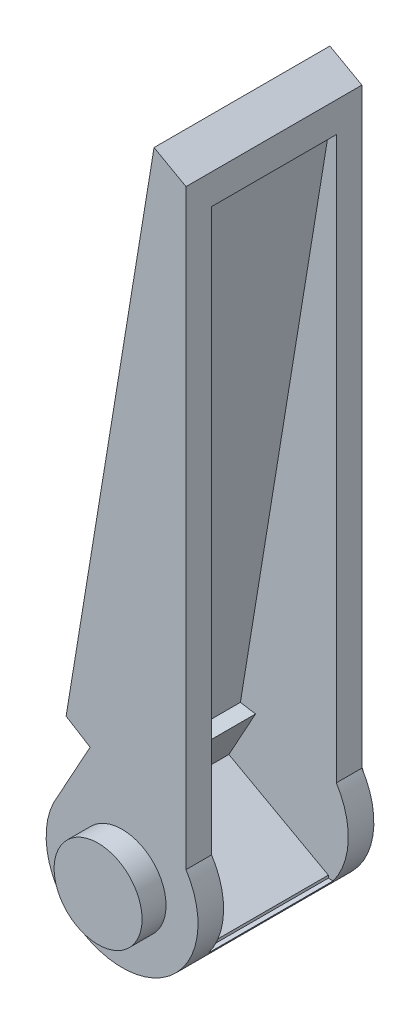
ISO-10303-21;
HEADER;
FILE_DESCRIPTION(('STEP AP214'),'2;1');
FILE_NAME('part.step','',(''),(''),'','','');
FILE_SCHEMA(('AUTOMOTIVE_DESIGN { 1 0 10303 214 1 1 1 1 }'));
ENDSEC;
DATA;
#1=APPLICATION_CONTEXT('core data for automotive mechanical design processes');
#2=APPLICATION_PROTOCOL_DEFINITION('international standard','automotive_design',2000,#1);
#3=PRODUCT_CONTEXT('',#1,'mechanical');
#4=PRODUCT('Part','Part','',(#3));
#5=PRODUCT_RELATED_PRODUCT_CATEGORY('part','',(#4));
#6=PRODUCT_DEFINITION_FORMATION('','',#4);
#7=PRODUCT_DEFINITION_CONTEXT('part definition',#1,'design');
#8=PRODUCT_DEFINITION('design','',#6,#7);
#9=PRODUCT_DEFINITION_SHAPE('','',#8);
#10=(LENGTH_UNIT() NAMED_UNIT(*) SI_UNIT(.MILLI.,.METRE.));
#11=(NAMED_UNIT(*) PLANE_ANGLE_UNIT() SI_UNIT($,.RADIAN.));
#12=(NAMED_UNIT(*) SI_UNIT($,.STERADIAN.) SOLID_ANGLE_UNIT());
#13=UNCERTAINTY_MEASURE_WITH_UNIT(LENGTH_MEASURE(1.E-05),#10,'distance_accuracy_value','');
#14=(GEOMETRIC_REPRESENTATION_CONTEXT(3) GLOBAL_UNCERTAINTY_ASSIGNED_CONTEXT((#13)) GLOBAL_UNIT_ASSIGNED_CONTEXT((#10,
#11,#12)) REPRESENTATION_CONTEXT('',''));
#15=CARTESIAN_POINT('',(0.,0.,0.));
#16=DIRECTION('',(0.,0.,1.));
#17=DIRECTION('',(1.,0.,0.));
#18=AXIS2_PLACEMENT_3D('',#15,#16,#17);
#19=CARTESIAN_POINT('',(3.5,0.,0.));
#20=DIRECTION('',(1.,0.,0.));
#21=DIRECTION('',(0.,0.,-1.));
#22=AXIS2_PLACEMENT_3D('',#19,#20,#21);
#23=PLANE('',#22);
#24=DIRECTION('',(0.,-1.,0.));
#25=VECTOR('',#24,1.);
#26=CARTESIAN_POINT('',(3.5,37.6792472828258,9.4));
#27=LINE('',#26,#25);
#28=CARTESIAN_POINT('',(3.5,37.6792472828258,9.4));
#29=VERTEX_POINT('',#28);
#30=CARTESIAN_POINT('',(3.5,37.4662104118118,9.39999999999999));
#31=VERTEX_POINT('',#30);
#32=EDGE_CURVE('E214',#29,#31,#27,.T.);
#33=ORIENTED_EDGE('',*,*,#32,.T.);
#34=DIRECTION('',(0.,0.,-1.));
#35=VECTOR('',#34,1.);
#36=CARTESIAN_POINT('',(3.5,37.4662104118117,0.));
#37=LINE('',#36,#35);
#38=CARTESIAN_POINT('',(3.5,37.4662104118118,1.6));
#39=VERTEX_POINT('',#38);
#40=EDGE_CURVE('E331',#31,#39,#37,.T.);
#41=ORIENTED_EDGE('',*,*,#40,.T.);
#42=DIRECTION('',(0.,1.,0.));
#43=VECTOR('',#42,1.);
#44=CARTESIAN_POINT('',(3.5,37.6792472828258,1.6));
#45=LINE('',#44,#43);
#46=CARTESIAN_POINT('',(3.5,37.6792472828258,1.6));
#47=VERTEX_POINT('',#46);
#48=EDGE_CURVE('E206',#39,#47,#45,.T.);
#49=ORIENTED_EDGE('',*,*,#48,.T.);
#50=DIRECTION('',(0.,0.,1.));
#51=VECTOR('',#50,1.);
#52=CARTESIAN_POINT('',(3.5,37.6792472828258,9.4));
#53=LINE('',#52,#51);
#54=EDGE_CURVE('E210',#47,#29,#53,.T.);
#55=ORIENTED_EDGE('',*,*,#54,.T.);
#56=EDGE_LOOP('',(#33,#41,#49,#55));
#57=FACE_BOUND('',#56,.T.);
#58=ADVANCED_FACE('F32',(#57),#23,.T.);
#59=CARTESIAN_POINT('',(3.5,37.6792472828258,9.4));
#60=DIRECTION('',(0.,1.,0.));
#61=DIRECTION('',(0.,0.,1.));
#62=AXIS2_PLACEMENT_3D('',#59,#60,#61);
#63=PLANE('',#62);
#64=DIRECTION('',(0.,0.,-1.));
#65=VECTOR('',#64,1.);
#66=CARTESIAN_POINT('',(3.53492178919848,37.6792472828258,9.4));
#67=LINE('',#66,#65);
#68=CARTESIAN_POINT('',(3.53492178919848,37.6792472828258,9.4));
#69=VERTEX_POINT('',#68);
#70=CARTESIAN_POINT('',(3.53492178919848,37.6792472828258,1.6));
#71=VERTEX_POINT('',#70);
#72=EDGE_CURVE('E11',#69,#71,#67,.T.);
#73=ORIENTED_EDGE('',*,*,#72,.F.);
#74=DIRECTION('',(1.,0.,0.));
#75=VECTOR('',#74,1.);
#76=CARTESIAN_POINT('',(3.5,37.6792472828258,9.4));
#77=LINE('',#76,#75);
#78=EDGE_CURVE('E228',#29,#69,#77,.T.);
#79=ORIENTED_EDGE('',*,*,#78,.F.);
#80=ORIENTED_EDGE('',*,*,#54,.F.);
#81=DIRECTION('',(1.,0.,0.));
#82=VECTOR('',#81,1.);
#83=CARTESIAN_POINT('',(3.5,37.6792472828258,1.6));
#84=LINE('',#83,#82);
#85=EDGE_CURVE('E220',#47,#71,#84,.T.);
#86=ORIENTED_EDGE('',*,*,#85,.T.);
#87=EDGE_LOOP('',(#73,#79,#80,#86));
#88=FACE_BOUND('',#87,.T.);
#89=ADVANCED_FACE('F370',(#88),#63,.F.);
#90=CARTESIAN_POINT('',(-2.39971386189744,1.32164909711709,0.));
#91=DIRECTION('',(0.875937323455358,-0.482424922011564,0.));
#92=DIRECTION('',(0.482424922011564,0.875937323455358,0.));
#93=AXIS2_PLACEMENT_3D('',#90,#91,#92);
#94=PLANE('',#93);
#95=DIRECTION('',(-0.482424922011564,-0.875937323455358,0.));
#96=VECTOR('',#95,1.);
#97=CARTESIAN_POINT('',(-0.3075366770254,5.12040824054968,1.59999999999999));
#98=LINE('',#97,#96);
#99=CARTESIAN_POINT('',(-1.05155104588315,3.76950383007239,1.6));
#100=VERTEX_POINT('',#99);
#101=CARTESIAN_POINT('',(-2.71966128708322,0.740721623272887,1.6));
#102=VERTEX_POINT('',#101);
#103=EDGE_CURVE('E178',#100,#102,#98,.T.);
#104=ORIENTED_EDGE('',*,*,#103,.F.);
#105=DIRECTION('',(0.,0.,1.));
#106=VECTOR('',#105,1.);
#107=CARTESIAN_POINT('',(-1.05155104588315,3.76950383007239,0.));
#108=LINE('',#107,#106);
#109=CARTESIAN_POINT('',(-1.05155104588315,3.76950383007239,9.4));
#110=VERTEX_POINT('',#109);
#111=EDGE_CURVE('E40',#100,#110,#108,.T.);
#112=ORIENTED_EDGE('',*,*,#111,.T.);
#113=DIRECTION('',(0.482424922011564,0.875937323455358,0.));
#114=VECTOR('',#113,1.);
#115=CARTESIAN_POINT('',(-0.307536677025399,5.12040824054968,9.39999999999999));
#116=LINE('',#115,#114);
#117=CARTESIAN_POINT('',(-2.71966128708322,0.740721623272887,9.39999999999999));
#118=VERTEX_POINT('',#117);
#119=EDGE_CURVE('E175',#118,#110,#116,.T.);
#120=ORIENTED_EDGE('',*,*,#119,.F.);
#121=DIRECTION('',(0.,0.,1.));
#122=VECTOR('',#121,1.);
#123=CARTESIAN_POINT('',(-2.71966128708322,0.740721623272887,9.39999999999999));
#124=LINE('',#123,#122);
#125=EDGE_CURVE('E196',#102,#118,#124,.T.);
#126=ORIENTED_EDGE('',*,*,#125,.F.);
#127=EDGE_LOOP('',(#104,#112,#120,#126));
#128=FACE_BOUND('',#127,.T.);
#129=ADVANCED_FACE('F172',(#128),#94,.T.);
#130=CARTESIAN_POINT('',(3.5,-2.85,1.59999999999999));
#131=VERTEX_POINT('',#130);
#132=CARTESIAN_POINT('',(3.5,-2.68477416394069,1.6));
#133=VERTEX_POINT('',#132);
#134=EDGE_CURVE('E207',#131,#133,#45,.T.);
#135=ORIENTED_EDGE('',*,*,#134,.T.);
#136=DIRECTION('',(0.,0.,1.));
#137=VECTOR('',#136,1.);
#138=CARTESIAN_POINT('',(3.5,-2.68477416394069,0.));
#139=LINE('',#138,#137);
#140=CARTESIAN_POINT('',(3.5,-2.68477416394069,9.39999999999999));
#141=VERTEX_POINT('',#140);
#142=EDGE_CURVE('E163',#133,#141,#139,.T.);
#143=ORIENTED_EDGE('',*,*,#142,.T.);
#144=CARTESIAN_POINT('',(3.5,-2.85,9.39999999999999));
#145=VERTEX_POINT('',#144);
#146=EDGE_CURVE('E213',#141,#145,#27,.T.);
#147=ORIENTED_EDGE('',*,*,#146,.T.);
#148=DIRECTION('',(0.,0.,-1.));
#149=VECTOR('',#148,1.);
#150=CARTESIAN_POINT('',(3.5,-2.85,9.39999999999999));
#151=LINE('',#150,#149);
#152=EDGE_CURVE('E217',#145,#131,#151,.T.);
#153=ORIENTED_EDGE('',*,*,#152,.T.);
#154=EDGE_LOOP('',(#135,#143,#147,#153));
#155=FACE_BOUND('',#154,.T.);
#156=ADVANCED_FACE('F342',(#155),#23,.T.);
#157=CARTESIAN_POINT('',(0.,0.,11.));
#158=DIRECTION('',(0.,0.,-1.));
#159=DIRECTION('',(-1.,0.,0.));
#160=AXIS2_PLACEMENT_3D('',#157,#158,#159);
#161=CYLINDRICAL_SURFACE('',#160,4.75);
#162=DIRECTION('',(0.,0.,-1.));
#163=VECTOR('',#162,1.);
#164=CARTESIAN_POINT('',(4.,2.5617376914899,11.));
#165=LINE('',#164,#163);
#166=CARTESIAN_POINT('',(4.,2.5617376914899,1.6));
#167=VERTEX_POINT('',#166);
#168=CARTESIAN_POINT('',(4.,2.5617376914899,0.));
#169=VERTEX_POINT('',#168);
#170=EDGE_CURVE('E147',#167,#169,#165,.T.);
#171=ORIENTED_EDGE('',*,*,#170,.F.);
#172=CARTESIAN_POINT('',(0.,0.,1.6));
#173=DIRECTION('',(0.,0.,-1.));
#174=DIRECTION('',(0.,1.,0.));
#175=AXIS2_PLACEMENT_3D('',#172,#173,#174);
#176=CIRCLE('',#175,4.75);
#177=CARTESIAN_POINT('',(3.8,-2.85,1.59999999999999));
#178=VERTEX_POINT('',#177);
#179=EDGE_CURVE('E235',#167,#178,#176,.T.);
#180=ORIENTED_EDGE('',*,*,#179,.T.);
#181=DIRECTION('',(0.,0.,-1.));
#182=VECTOR('',#181,1.);
#183=CARTESIAN_POINT('',(3.8,-2.85,11.));
#184=LINE('',#183,#182);
#185=CARTESIAN_POINT('',(3.8,-2.85,9.39999999999999));
#186=VERTEX_POINT('',#185);
#187=EDGE_CURVE('E160',#178,#186,#184,.F.);
#188=ORIENTED_EDGE('',*,*,#187,.T.);
#189=CARTESIAN_POINT('',(0.,0.,9.39999999999999));
#190=DIRECTION('',(0.,0.,1.));
#191=DIRECTION('',(0.,-1.,0.));
#192=AXIS2_PLACEMENT_3D('',#189,#190,#191);
#193=CIRCLE('',#192,4.75);
#194=CARTESIAN_POINT('',(4.,2.5617376914899,9.39999999999999));
#195=VERTEX_POINT('',#194);
#196=EDGE_CURVE('E224',#186,#195,#193,.T.);
#197=ORIENTED_EDGE('',*,*,#196,.T.);
#198=CARTESIAN_POINT('',(4.,2.5617376914899,11.));
#199=VERTEX_POINT('',#198);
#200=EDGE_CURVE('E148',#199,#195,#165,.T.);
#201=ORIENTED_EDGE('',*,*,#200,.F.);
#202=CARTESIAN_POINT('',(0.,0.,11.));
#203=DIRECTION('',(0.,0.,1.));
#204=DIRECTION('',(1.,0.,0.));
#205=AXIS2_PLACEMENT_3D('',#202,#203,#204);
#206=CIRCLE('',#205,4.75);
#207=CARTESIAN_POINT('',(-4.,2.5617376914899,11.));
#208=VERTEX_POINT('',#207);
#209=EDGE_CURVE('E140',#208,#199,#206,.T.);
#210=ORIENTED_EDGE('',*,*,#209,.F.);
#211=DIRECTION('',(0.,0.,-1.));
#212=VECTOR('',#211,1.);
#213=CARTESIAN_POINT('',(-4.,2.5617376914899,11.));
#214=LINE('',#213,#212);
#215=CARTESIAN_POINT('',(-4.,2.5617376914899,0.));
#216=VERTEX_POINT('',#215);
#217=EDGE_CURVE('E124',#208,#216,#214,.T.);
#218=ORIENTED_EDGE('',*,*,#217,.T.);
#219=CARTESIAN_POINT('',(0.,0.,0.));
#220=DIRECTION('',(0.,0.,1.));
#221=DIRECTION('',(1.,0.,0.));
#222=AXIS2_PLACEMENT_3D('',#219,#220,#221);
#223=CIRCLE('',#222,4.75);
#224=EDGE_CURVE('E128',#216,#169,#223,.T.);
#225=ORIENTED_EDGE('',*,*,#224,.T.);
#226=EDGE_LOOP('',(#171,#180,#188,#197,#201,#210,#218,#225));
#227=FACE_BOUND('',#226,.T.);
#228=ADVANCED_FACE('F34',(#227),#161,.T.);
#229=CARTESIAN_POINT('',(4.,2.5617376914899,11.));
#230=DIRECTION('',(-1.,0.,0.));
#231=DIRECTION('',(0.,0.,1.));
#232=AXIS2_PLACEMENT_3D('',#229,#230,#231);
#233=PLANE('',#232);
#234=DIRECTION('',(0.,0.,-1.));
#235=VECTOR('',#234,1.);
#236=CARTESIAN_POINT('',(4.,37.6792472828258,11.));
#237=LINE('',#236,#235);
#238=CARTESIAN_POINT('',(4.00000000000002,37.6792472828258,9.39999999999999));
#239=VERTEX_POINT('',#238);
#240=CARTESIAN_POINT('',(4.00000000000002,37.6792472828258,1.6));
#241=VERTEX_POINT('',#240);
#242=EDGE_CURVE('E151',#239,#241,#237,.T.);
#243=ORIENTED_EDGE('',*,*,#242,.T.);
#244=DIRECTION('',(0.,-1.,0.));
#245=VECTOR('',#244,1.);
#246=CARTESIAN_POINT('',(4.,2.5617376914899,1.6));
#247=LINE('',#246,#245);
#248=EDGE_CURVE('E157',#241,#167,#247,.T.);
#249=ORIENTED_EDGE('',*,*,#248,.T.);
#250=ORIENTED_EDGE('',*,*,#170,.T.);
#251=DIRECTION('',(0.,1.,0.));
#252=VECTOR('',#251,1.);
#253=CARTESIAN_POINT('',(4.,2.5617376914899,0.));
#254=LINE('',#253,#252);
#255=CARTESIAN_POINT('',(4.,39.5617376914899,0.));
#256=VERTEX_POINT('',#255);
#257=EDGE_CURVE('E131',#169,#256,#254,.T.);
#258=ORIENTED_EDGE('',*,*,#257,.T.);
#259=DIRECTION('',(0.,0.,-1.));
#260=VECTOR('',#259,1.);
#261=CARTESIAN_POINT('',(4.,39.5617376914899,11.));
#262=LINE('',#261,#260);
#263=CARTESIAN_POINT('',(4.,39.5617376914899,11.));
#264=VERTEX_POINT('',#263);
#265=EDGE_CURVE('E144',#264,#256,#262,.T.);
#266=ORIENTED_EDGE('',*,*,#265,.F.);
#267=DIRECTION('',(0.,1.,0.));
#268=VECTOR('',#267,1.);
#269=CARTESIAN_POINT('',(4.,2.5617376914899,11.));
#270=LINE('',#269,#268);
#271=EDGE_CURVE('E91',#199,#264,#270,.T.);
#272=ORIENTED_EDGE('',*,*,#271,.F.);
#273=ORIENTED_EDGE('',*,*,#200,.T.);
#274=DIRECTION('',(0.,1.,0.));
#275=VECTOR('',#274,1.);
#276=CARTESIAN_POINT('',(4.,2.5617376914899,9.39999999999999));
#277=LINE('',#276,#275);
#278=EDGE_CURVE('E154',#195,#239,#277,.T.);
#279=ORIENTED_EDGE('',*,*,#278,.T.);
#280=EDGE_LOOP('',(#243,#249,#250,#258,#266,#272,#273,#279));
#281=FACE_BOUND('',#280,.T.);
#282=ADVANCED_FACE('F251',(#281),#233,.F.);
#283=CARTESIAN_POINT('',(4.,39.5617376914899,11.));
#284=DIRECTION('',(-0.48777563332478,-0.872969032402989,0.));
#285=DIRECTION('',(0.872969032402989,-0.48777563332478,0.));
#286=AXIS2_PLACEMENT_3D('',#283,#284,#285);
#287=PLANE('',#286);
#288=DIRECTION('',(-0.872969032402989,0.48777563332478,0.));
#289=VECTOR('',#288,1.);
#290=CARTESIAN_POINT('',(4.,39.5617376914899,0.));
#291=LINE('',#290,#289);
#292=CARTESIAN_POINT('',(2.,40.6792472828258,0.));
#293=VERTEX_POINT('',#292);
#294=EDGE_CURVE('E134',#256,#293,#291,.T.);
#295=ORIENTED_EDGE('',*,*,#294,.T.);
#296=DIRECTION('',(0.,0.,-1.));
#297=VECTOR('',#296,1.);
#298=CARTESIAN_POINT('',(2.,40.6792472828258,11.));
#299=LINE('',#298,#297);
#300=CARTESIAN_POINT('',(2.,40.6792472828258,11.));
#301=VERTEX_POINT('',#300);
#302=EDGE_CURVE('E119',#301,#293,#299,.T.);
#303=ORIENTED_EDGE('',*,*,#302,.F.);
#304=DIRECTION('',(-0.872969032402989,0.48777563332478,0.));
#305=VECTOR('',#304,1.);
#306=CARTESIAN_POINT('',(4.,39.5617376914899,11.));
#307=LINE('',#306,#305);
#308=EDGE_CURVE('E107',#264,#301,#307,.T.);
#309=ORIENTED_EDGE('',*,*,#308,.F.);
#310=ORIENTED_EDGE('',*,*,#265,.T.);
#311=EDGE_LOOP('',(#295,#303,#309,#310));
#312=FACE_BOUND('',#311,.T.);
#313=ADVANCED_FACE('F255',(#312),#287,.F.);
#314=CARTESIAN_POINT('',(2.,40.6792472828258,11.));
#315=DIRECTION('',(0.986829357047507,-0.161764705882353,0.));
#316=DIRECTION('',(0.161764705882353,0.986829357047507,0.));
#317=AXIS2_PLACEMENT_3D('',#314,#315,#316);
#318=PLANE('',#317);
#319=DIRECTION('',(-0.161764705882353,-0.986829357047507,0.));
#320=VECTOR('',#319,1.);
#321=CARTESIAN_POINT('',(2.,40.6792472828258,0.));
#322=LINE('',#321,#320);
#323=CARTESIAN_POINT('',(-3.5,7.12704914321057,0.));
#324=VERTEX_POINT('',#323);
#325=EDGE_CURVE('E116',#293,#324,#322,.T.);
#326=ORIENTED_EDGE('',*,*,#325,.T.);
#327=DIRECTION('',(0.,0.,-1.));
#328=VECTOR('',#327,1.);
#329=CARTESIAN_POINT('',(-3.5,7.12704914321057,11.));
#330=LINE('',#329,#328);
#331=CARTESIAN_POINT('',(-3.5,7.12704914321057,11.));
#332=VERTEX_POINT('',#331);
#333=EDGE_CURVE('E113',#332,#324,#330,.T.);
#334=ORIENTED_EDGE('',*,*,#333,.F.);
#335=DIRECTION('',(-0.161764705882353,-0.986829357047507,0.));
#336=VECTOR('',#335,1.);
#337=CARTESIAN_POINT('',(2.,40.6792472828258,11.));
#338=LINE('',#337,#336);
#339=EDGE_CURVE('E100',#301,#332,#338,.T.);
#340=ORIENTED_EDGE('',*,*,#339,.F.);
#341=ORIENTED_EDGE('',*,*,#302,.T.);
#342=EDGE_LOOP('',(#326,#334,#340,#341));
#343=FACE_BOUND('',#342,.T.);
#344=ADVANCED_FACE('F114',(#343),#318,.F.);
#345=CARTESIAN_POINT('',(-3.5,7.12704914321057,11.));
#346=DIRECTION('',(0.528540447567041,0.848908119460305,0.));
#347=DIRECTION('',(-0.848908119460305,0.528540447567041,0.));
#348=AXIS2_PLACEMENT_3D('',#345,#346,#347);
#349=PLANE('',#348);
#350=DIRECTION('',(0.848908119460305,-0.528540447567041,0.));
#351=VECTOR('',#350,1.);
#352=CARTESIAN_POINT('',(-3.5,7.12704914321057,0.));
#353=LINE('',#352,#351);
#354=CARTESIAN_POINT('',(-2.,6.19313102748493,0.));
#355=VERTEX_POINT('',#354);
#356=EDGE_CURVE('E137',#324,#355,#353,.T.);
#357=ORIENTED_EDGE('',*,*,#356,.T.);
#358=DIRECTION('',(0.,0.,-1.));
#359=VECTOR('',#358,1.);
#360=CARTESIAN_POINT('',(-2.,6.19313102748493,11.));
#361=LINE('',#360,#359);
#362=CARTESIAN_POINT('',(-2.,6.19313102748493,11.));
#363=VERTEX_POINT('',#362);
#364=EDGE_CURVE('E120',#363,#355,#361,.T.);
#365=ORIENTED_EDGE('',*,*,#364,.F.);
#366=DIRECTION('',(0.848908119460305,-0.528540447567041,0.));
#367=VECTOR('',#366,1.);
#368=CARTESIAN_POINT('',(-3.5,7.12704914321057,11.));
#369=LINE('',#368,#367);
#370=EDGE_CURVE('E104',#332,#363,#369,.T.);
#371=ORIENTED_EDGE('',*,*,#370,.F.);
#372=ORIENTED_EDGE('',*,*,#333,.T.);
#373=EDGE_LOOP('',(#357,#365,#371,#372));
#374=FACE_BOUND('',#373,.T.);
#375=ADVANCED_FACE('F122',(#374),#349,.F.);
#376=CARTESIAN_POINT('',(-2.,6.19313102748493,11.));
#377=DIRECTION('',(0.875937323455358,-0.482424922011564,0.));
#378=DIRECTION('',(0.482424922011564,0.875937323455358,0.));
#379=AXIS2_PLACEMENT_3D('',#376,#377,#378);
#380=PLANE('',#379);
#381=DIRECTION('',(-0.482424922011564,-0.875937323455358,0.));
#382=VECTOR('',#381,1.);
#383=CARTESIAN_POINT('',(-2.,6.19313102748493,0.));
#384=LINE('',#383,#382);
#385=EDGE_CURVE('E82',#355,#216,#384,.T.);
#386=ORIENTED_EDGE('',*,*,#385,.T.);
#387=ORIENTED_EDGE('',*,*,#217,.F.);
#388=DIRECTION('',(-0.482424922011564,-0.875937323455358,0.));
#389=VECTOR('',#388,1.);
#390=CARTESIAN_POINT('',(-2.,6.19313102748493,11.));
#391=LINE('',#390,#389);
#392=EDGE_CURVE('E55',#363,#208,#391,.T.);
#393=ORIENTED_EDGE('',*,*,#392,.F.);
#394=ORIENTED_EDGE('',*,*,#364,.T.);
#395=EDGE_LOOP('',(#386,#387,#393,#394));
#396=FACE_BOUND('',#395,.T.);
#397=ADVANCED_FACE('F259',(#396),#380,.F.);
#398=CARTESIAN_POINT('',(0.,0.,11.));
#399=DIRECTION('',(0.,0.,1.));
#400=DIRECTION('',(1.,0.,0.));
#401=AXIS2_PLACEMENT_3D('',#398,#399,#400);
#402=PLANE('',#401);
#403=CARTESIAN_POINT('',(0.,0.,11.));
#404=DIRECTION('',(0.,0.,1.));
#405=DIRECTION('',(1.,0.,0.));
#406=AXIS2_PLACEMENT_3D('',#403,#404,#405);
#407=CIRCLE('',#406,2.75);
#408=CARTESIAN_POINT('',(2.75,0.,11.));
#409=VERTEX_POINT('',#408);
#410=EDGE_CURVE('E150',#409,#409,#407,.T.);
#411=ORIENTED_EDGE('',*,*,#410,.F.);
#412=EDGE_LOOP('',(#411));
#413=FACE_BOUND('',#412,.T.);
#414=ORIENTED_EDGE('',*,*,#209,.T.);
#415=ORIENTED_EDGE('',*,*,#271,.T.);
#416=ORIENTED_EDGE('',*,*,#308,.T.);
#417=ORIENTED_EDGE('',*,*,#339,.T.);
#418=ORIENTED_EDGE('',*,*,#370,.T.);
#419=ORIENTED_EDGE('',*,*,#392,.T.);
#420=EDGE_LOOP('',(#414,#415,#416,#417,#418,#419));
#421=FACE_BOUND('',#420,.T.);
#422=ADVANCED_FACE('F102',(#413,#421),#402,.T.);
#423=CARTESIAN_POINT('',(0.,0.,0.));
#424=DIRECTION('',(0.,0.,1.));
#425=DIRECTION('',(1.,0.,0.));
#426=AXIS2_PLACEMENT_3D('',#423,#424,#425);
#427=PLANE('',#426);
#428=CARTESIAN_POINT('',(0.,0.,0.));
#429=DIRECTION('',(0.,0.,1.));
#430=DIRECTION('',(1.,0.,0.));
#431=AXIS2_PLACEMENT_3D('',#428,#429,#430);
#432=CIRCLE('',#431,2.75);
#433=CARTESIAN_POINT('',(2.75,0.,0.));
#434=VERTEX_POINT('',#433);
#435=EDGE_CURVE('E241',#434,#434,#432,.T.);
#436=ORIENTED_EDGE('',*,*,#435,.T.);
#437=EDGE_LOOP('',(#436));
#438=FACE_BOUND('',#437,.T.);
#439=ORIENTED_EDGE('',*,*,#224,.F.);
#440=ORIENTED_EDGE('',*,*,#385,.F.);
#441=ORIENTED_EDGE('',*,*,#356,.F.);
#442=ORIENTED_EDGE('',*,*,#325,.F.);
#443=ORIENTED_EDGE('',*,*,#294,.F.);
#444=ORIENTED_EDGE('',*,*,#257,.F.);
#445=EDGE_LOOP('',(#439,#440,#441,#442,#443,#444));
#446=FACE_BOUND('',#445,.T.);
#447=ADVANCED_FACE('F258',(#438,#446),#427,.F.);
#448=CARTESIAN_POINT('',(0.,0.,-1.5));
#449=DIRECTION('',(0.,0.,1.));
#450=DIRECTION('',(1.,0.,0.));
#451=AXIS2_PLACEMENT_3D('',#448,#449,#450);
#452=CYLINDRICAL_SURFACE('',#451,2.75);
#453=CARTESIAN_POINT('',(0.,0.,-1.5));
#454=DIRECTION('',(0.,0.,1.));
#455=DIRECTION('',(1.,0.,0.));
#456=AXIS2_PLACEMENT_3D('',#453,#454,#455);
#457=CIRCLE('',#456,2.75);
#458=CARTESIAN_POINT('',(2.75,0.,-1.5));
#459=VERTEX_POINT('',#458);
#460=EDGE_CURVE('E132',#459,#459,#457,.T.);
#461=ORIENTED_EDGE('',*,*,#460,.T.);
#462=EDGE_LOOP('',(#461));
#463=FACE_BOUND('',#462,.T.);
#464=ORIENTED_EDGE('',*,*,#435,.F.);
#465=EDGE_LOOP('',(#464));
#466=FACE_BOUND('',#465,.T.);
#467=ADVANCED_FACE('F410',(#463,#466),#452,.T.);
#468=CARTESIAN_POINT('',(0.,0.,-1.5));
#469=DIRECTION('',(0.,0.,1.));
#470=DIRECTION('',(1.,0.,0.));
#471=AXIS2_PLACEMENT_3D('',#468,#469,#470);
#472=PLANE('',#471);
#473=ORIENTED_EDGE('',*,*,#460,.F.);
#474=EDGE_LOOP('',(#473));
#475=FACE_BOUND('',#474,.T.);
#476=ADVANCED_FACE('F406',(#475),#472,.F.);
#477=CARTESIAN_POINT('',(0.,0.,12.5));
#478=DIRECTION('',(0.,0.,-1.));
#479=DIRECTION('',(-1.,0.,0.));
#480=AXIS2_PLACEMENT_3D('',#477,#478,#479);
#481=CYLINDRICAL_SURFACE('',#480,2.75);
#482=CARTESIAN_POINT('',(0.,0.,12.5));
#483=DIRECTION('',(0.,0.,1.));
#484=DIRECTION('',(1.,0.,0.));
#485=AXIS2_PLACEMENT_3D('',#482,#483,#484);
#486=CIRCLE('',#485,2.75);
#487=CARTESIAN_POINT('',(2.75,0.,12.5));
#488=VERTEX_POINT('',#487);
#489=EDGE_CURVE('E238',#488,#488,#486,.T.);
#490=ORIENTED_EDGE('',*,*,#489,.F.);
#491=EDGE_LOOP('',(#490));
#492=FACE_BOUND('',#491,.T.);
#493=ORIENTED_EDGE('',*,*,#410,.T.);
#494=EDGE_LOOP('',(#493));
#495=FACE_BOUND('',#494,.T.);
#496=ADVANCED_FACE('F402',(#492,#495),#481,.T.);
#497=CARTESIAN_POINT('',(0.,0.,12.5));
#498=DIRECTION('',(0.,0.,1.));
#499=DIRECTION('',(1.,0.,0.));
#500=AXIS2_PLACEMENT_3D('',#497,#498,#499);
#501=PLANE('',#500);
#502=ORIENTED_EDGE('',*,*,#489,.T.);
#503=EDGE_LOOP('',(#502));
#504=FACE_BOUND('',#503,.T.);
#505=ADVANCED_FACE('F399',(#504),#501,.T.);
#506=CARTESIAN_POINT('',(3.5,-2.85,9.39999999999999));
#507=DIRECTION('',(0.,-1.,0.));
#508=DIRECTION('',(0.,0.,-1.));
#509=AXIS2_PLACEMENT_3D('',#506,#507,#508);
#510=PLANE('',#509);
#511=DIRECTION('',(1.,0.,0.));
#512=VECTOR('',#511,1.);
#513=CARTESIAN_POINT('',(3.5,-2.85,1.59999999999999));
#514=LINE('',#513,#512);
#515=EDGE_CURVE('E221',#131,#178,#514,.T.);
#516=ORIENTED_EDGE('',*,*,#515,.F.);
#517=ORIENTED_EDGE('',*,*,#152,.F.);
#518=DIRECTION('',(1.,0.,0.));
#519=VECTOR('',#518,1.);
#520=CARTESIAN_POINT('',(3.5,-2.85,9.39999999999999));
#521=LINE('',#520,#519);
#522=EDGE_CURVE('E225',#145,#186,#521,.T.);
#523=ORIENTED_EDGE('',*,*,#522,.T.);
#524=ORIENTED_EDGE('',*,*,#187,.F.);
#525=EDGE_LOOP('',(#516,#517,#523,#524));
#526=FACE_BOUND('',#525,.T.);
#527=ADVANCED_FACE('F346',(#526),#510,.F.);
#528=CARTESIAN_POINT('',(3.5,37.6792472828258,1.6));
#529=DIRECTION('',(0.,0.,-1.));
#530=DIRECTION('',(0.,1.,0.));
#531=AXIS2_PLACEMENT_3D('',#528,#529,#530);
#532=PLANE('',#531);
#533=ORIENTED_EDGE('',*,*,#48,.F.);
#534=DIRECTION('',(-0.161764705882353,-0.986829357047507,0.));
#535=VECTOR('',#534,1.);
#536=CARTESIAN_POINT('',(3.54709187213684,37.7534896526664,1.6));
#537=LINE('',#536,#535);
#538=CARTESIAN_POINT('',(-1.99824964229623,3.92469015374053,1.6));
#539=VERTEX_POINT('',#538);
#540=EDGE_CURVE('E317',#39,#539,#537,.T.);
#541=ORIENTED_EDGE('',*,*,#540,.T.);
#542=DIRECTION('',(0.986829357047507,-0.161764705882353,0.));
#543=VECTOR('',#542,1.);
#544=CARTESIAN_POINT('',(-1.99824964229623,3.92469015374053,1.6));
#545=LINE('',#544,#543);
#546=EDGE_CURVE('E320',#539,#100,#545,.T.);
#547=ORIENTED_EDGE('',*,*,#546,.T.);
#548=ORIENTED_EDGE('',*,*,#103,.T.);
#549=DIRECTION('',(0.875937323455358,-0.482424922011564,0.));
#550=VECTOR('',#549,1.);
#551=CARTESIAN_POINT('',(-2.71966128708322,0.740721623272887,1.6));
#552=LINE('',#551,#550);
#553=EDGE_CURVE('E198',#102,#133,#552,.T.);
#554=ORIENTED_EDGE('',*,*,#553,.T.);
#555=ORIENTED_EDGE('',*,*,#134,.F.);
#556=ORIENTED_EDGE('',*,*,#515,.T.);
#557=ORIENTED_EDGE('',*,*,#179,.F.);
#558=ORIENTED_EDGE('',*,*,#248,.F.);
#559=DIRECTION('',(0.986829357047507,-0.161764705882353,0.));
#560=VECTOR('',#559,1.);
#561=CARTESIAN_POINT('',(3.54709187213684,37.7534896526664,1.6));
#562=LINE('',#561,#560);
#563=CARTESIAN_POINT('',(3.54709187213684,37.7534896526664,1.6));
#564=VERTEX_POINT('',#563);
#565=EDGE_CURVE('E351',#564,#241,#562,.T.);
#566=ORIENTED_EDGE('',*,*,#565,.F.);
#567=EDGE_CURVE('E324',#564,#71,#537,.T.);
#568=ORIENTED_EDGE('',*,*,#567,.T.);
#569=ORIENTED_EDGE('',*,*,#85,.F.);
#570=EDGE_LOOP('',(#533,#541,#547,#548,#554,#555,#556,#557,#558,#566,#568,#569));
#571=FACE_BOUND('',#570,.T.);
#572=ADVANCED_FACE('F319',(#571),#532,.F.);
#573=CARTESIAN_POINT('',(3.5,37.6792472828258,9.4));
#574=DIRECTION('',(0.,0.,1.));
#575=DIRECTION('',(0.,-1.,0.));
#576=AXIS2_PLACEMENT_3D('',#573,#574,#575);
#577=PLANE('',#576);
#578=DIRECTION('',(0.161764705882353,0.986829357047507,0.));
#579=VECTOR('',#578,1.);
#580=CARTESIAN_POINT('',(3.54709187213684,37.7534896526664,9.39999999999999));
#581=LINE('',#580,#579);
#582=CARTESIAN_POINT('',(-1.99824964229623,3.92469015374053,9.4));
#583=VERTEX_POINT('',#582);
#584=EDGE_CURVE('E328',#583,#31,#581,.T.);
#585=ORIENTED_EDGE('',*,*,#584,.T.);
#586=ORIENTED_EDGE('',*,*,#32,.F.);
#587=ORIENTED_EDGE('',*,*,#78,.T.);
#588=CARTESIAN_POINT('',(3.54709187213684,37.7534896526664,9.39999999999999));
#589=VERTEX_POINT('',#588);
#590=EDGE_CURVE('E46',#69,#589,#581,.T.);
#591=ORIENTED_EDGE('',*,*,#590,.T.);
#592=DIRECTION('',(0.986829357047507,-0.161764705882353,0.));
#593=VECTOR('',#592,1.);
#594=CARTESIAN_POINT('',(3.54709187213684,37.7534896526664,9.39999999999999));
#595=LINE('',#594,#593);
#596=EDGE_CURVE('E334',#589,#239,#595,.T.);
#597=ORIENTED_EDGE('',*,*,#596,.T.);
#598=ORIENTED_EDGE('',*,*,#278,.F.);
#599=ORIENTED_EDGE('',*,*,#196,.F.);
#600=ORIENTED_EDGE('',*,*,#522,.F.);
#601=ORIENTED_EDGE('',*,*,#146,.F.);
#602=DIRECTION('',(0.875937323455358,-0.482424922011564,0.));
#603=VECTOR('',#602,1.);
#604=CARTESIAN_POINT('',(-2.71966128708322,0.740721623272887,9.39999999999999));
#605=LINE('',#604,#603);
#606=EDGE_CURVE('E195',#118,#141,#605,.T.);
#607=ORIENTED_EDGE('',*,*,#606,.F.);
#608=ORIENTED_EDGE('',*,*,#119,.T.);
#609=DIRECTION('',(0.986829357047507,-0.161764705882353,0.));
#610=VECTOR('',#609,1.);
#611=CARTESIAN_POINT('',(-1.99824964229623,3.92469015374053,9.4));
#612=LINE('',#611,#610);
#613=EDGE_CURVE('E191',#583,#110,#612,.T.);
#614=ORIENTED_EDGE('',*,*,#613,.F.);
#615=EDGE_LOOP('',(#585,#586,#587,#591,#597,#598,#599,#600,#601,#607,#608,#614));
#616=FACE_BOUND('',#615,.T.);
#617=ADVANCED_FACE('F189',(#616),#577,.F.);
#618=CARTESIAN_POINT('',(-2.71966128708322,0.740721623272887,9.39999999999999));
#619=DIRECTION('',(0.482424922011564,0.875937323455358,0.));
#620=DIRECTION('',(-0.875937323455358,0.482424922011564,0.));
#621=AXIS2_PLACEMENT_3D('',#618,#619,#620);
#622=PLANE('',#621);
#623=ORIENTED_EDGE('',*,*,#553,.F.);
#624=ORIENTED_EDGE('',*,*,#125,.T.);
#625=ORIENTED_EDGE('',*,*,#606,.T.);
#626=ORIENTED_EDGE('',*,*,#142,.F.);
#627=EDGE_LOOP('',(#623,#624,#625,#626));
#628=FACE_BOUND('',#627,.T.);
#629=ADVANCED_FACE('F340',(#628),#622,.T.);
#630=CARTESIAN_POINT('',(-1.99824964229623,3.92469015374053,9.4));
#631=DIRECTION('',(0.161764705882353,0.986829357047507,0.));
#632=DIRECTION('',(-0.986829357047507,0.161764705882353,0.));
#633=AXIS2_PLACEMENT_3D('',#630,#631,#632);
#634=PLANE('',#633);
#635=ORIENTED_EDGE('',*,*,#546,.F.);
#636=DIRECTION('',(0.,0.,1.));
#637=VECTOR('',#636,1.);
#638=CARTESIAN_POINT('',(-1.99824964229623,3.92469015374053,9.4));
#639=LINE('',#638,#637);
#640=EDGE_CURVE('E326',#539,#583,#639,.T.);
#641=ORIENTED_EDGE('',*,*,#640,.T.);
#642=ORIENTED_EDGE('',*,*,#613,.T.);
#643=ORIENTED_EDGE('',*,*,#111,.F.);
#644=EDGE_LOOP('',(#635,#641,#642,#643));
#645=FACE_BOUND('',#644,.T.);
#646=ADVANCED_FACE('F330',(#645),#634,.T.);
#647=CARTESIAN_POINT('',(-2.57247442389873,0.421689490285218,0.));
#648=DIRECTION('',(0.986829357047507,-0.161764705882353,0.));
#649=DIRECTION('',(0.161764705882353,0.986829357047507,0.));
#650=AXIS2_PLACEMENT_3D('',#647,#648,#649);
#651=PLANE('',#650);
#652=ORIENTED_EDGE('',*,*,#584,.F.);
#653=ORIENTED_EDGE('',*,*,#640,.F.);
#654=ORIENTED_EDGE('',*,*,#540,.F.);
#655=ORIENTED_EDGE('',*,*,#40,.F.);
#656=EDGE_LOOP('',(#652,#653,#654,#655));
#657=FACE_BOUND('',#656,.T.);
#658=ADVANCED_FACE('F327',(#657),#651,.T.);
#659=CARTESIAN_POINT('',(3.54709187213684,37.7534896526664,9.39999999999999));
#660=DIRECTION('',(-0.161764705882353,-0.986829357047507,0.));
#661=DIRECTION('',(0.986829357047507,-0.161764705882353,0.));
#662=AXIS2_PLACEMENT_3D('',#659,#660,#661);
#663=PLANE('',#662);
#664=ORIENTED_EDGE('',*,*,#242,.F.);
#665=ORIENTED_EDGE('',*,*,#596,.F.);
#666=DIRECTION('',(0.,0.,-1.));
#667=VECTOR('',#666,1.);
#668=CARTESIAN_POINT('',(3.54709187213684,37.7534896526664,9.39999999999999));
#669=LINE('',#668,#667);
#670=EDGE_CURVE('E354',#589,#564,#669,.T.);
#671=ORIENTED_EDGE('',*,*,#670,.T.);
#672=ORIENTED_EDGE('',*,*,#565,.T.);
#673=EDGE_LOOP('',(#664,#665,#671,#672));
#674=FACE_BOUND('',#673,.T.);
#675=ADVANCED_FACE('F360',(#674),#663,.T.);
#676=ORIENTED_EDGE('',*,*,#72,.T.);
#677=ORIENTED_EDGE('',*,*,#567,.F.);
#678=ORIENTED_EDGE('',*,*,#670,.F.);
#679=ORIENTED_EDGE('',*,*,#590,.F.);
#680=EDGE_LOOP('',(#676,#677,#678,#679));
#681=FACE_BOUND('',#680,.T.);
#682=ADVANCED_FACE('F356',(#681),#651,.T.);
#683=CLOSED_SHELL('',(#58,#89,#129,#156,#228,#282,#313,#344,#375,#397,#422,#447,#467,#476,#496,
#505,#527,#572,#617,#629,#646,#658,#675,#682));
#684=MANIFOLD_SOLID_BREP('B2',#683);
#685=ADVANCED_BREP_SHAPE_REPRESENTATION('',(#18,#684),#14);
#686=SHAPE_DEFINITION_REPRESENTATION(#9,#685);
ENDSEC;
END-ISO-10303-21;
